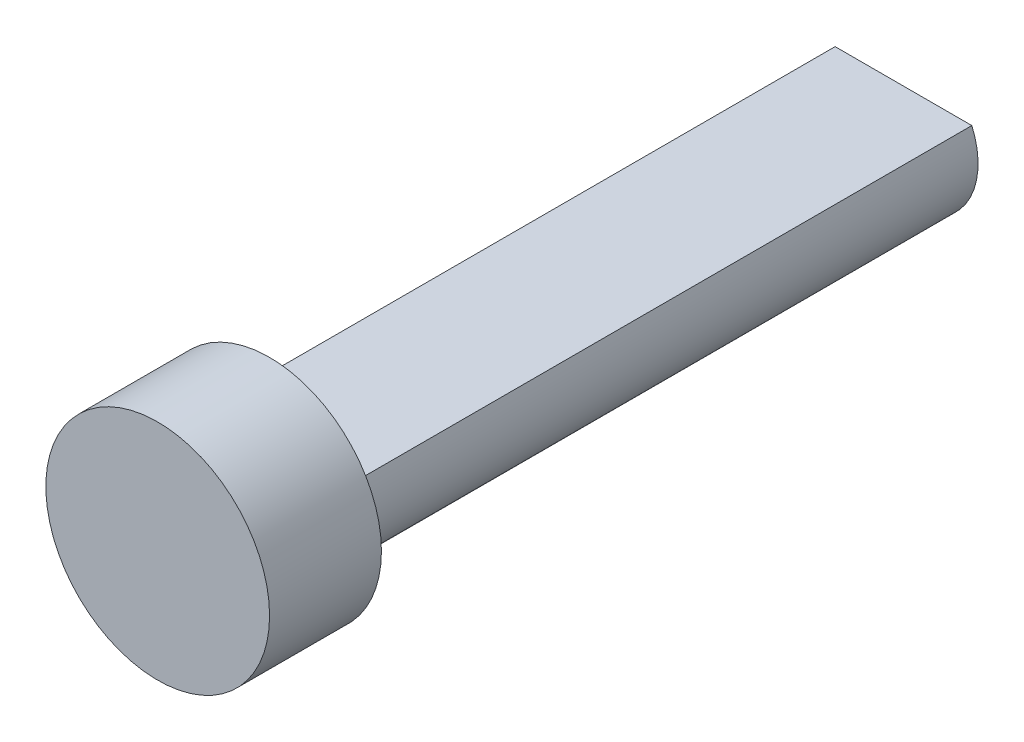
ISO-10303-21;
HEADER;
FILE_DESCRIPTION(('STEP AP214'),'2;1');
FILE_NAME('part.step','',(''),(''),'','','');
FILE_SCHEMA(('AUTOMOTIVE_DESIGN { 1 0 10303 214 1 1 1 1 }'));
ENDSEC;
DATA;
#1=APPLICATION_CONTEXT('core data for automotive mechanical design processes');
#2=APPLICATION_PROTOCOL_DEFINITION('international standard','automotive_design',2000,#1);
#3=PRODUCT_CONTEXT('',#1,'mechanical');
#4=PRODUCT('Part','Part','',(#3));
#5=PRODUCT_RELATED_PRODUCT_CATEGORY('part','',(#4));
#6=PRODUCT_DEFINITION_FORMATION('','',#4);
#7=PRODUCT_DEFINITION_CONTEXT('part definition',#1,'design');
#8=PRODUCT_DEFINITION('design','',#6,#7);
#9=PRODUCT_DEFINITION_SHAPE('','',#8);
#10=(LENGTH_UNIT() NAMED_UNIT(*) SI_UNIT(.MILLI.,.METRE.));
#11=(NAMED_UNIT(*) PLANE_ANGLE_UNIT() SI_UNIT($,.RADIAN.));
#12=(NAMED_UNIT(*) SI_UNIT($,.STERADIAN.) SOLID_ANGLE_UNIT());
#13=UNCERTAINTY_MEASURE_WITH_UNIT(LENGTH_MEASURE(1.E-05),#10,'distance_accuracy_value','');
#14=(GEOMETRIC_REPRESENTATION_CONTEXT(3) GLOBAL_UNCERTAINTY_ASSIGNED_CONTEXT((#13)) GLOBAL_UNIT_ASSIGNED_CONTEXT((#10,
#11,#12)) REPRESENTATION_CONTEXT('',''));
#15=CARTESIAN_POINT('',(0.,0.,0.));
#16=DIRECTION('',(0.,0.,1.));
#17=DIRECTION('',(1.,0.,0.));
#18=AXIS2_PLACEMENT_3D('',#15,#16,#17);
#19=CARTESIAN_POINT('',(0.,0.,20.));
#20=DIRECTION('',(0.,0.,-1.));
#21=DIRECTION('',(-1.,0.,0.));
#22=AXIS2_PLACEMENT_3D('',#19,#20,#21);
#23=CYLINDRICAL_SURFACE('',#22,2.);
#24=CARTESIAN_POINT('',(0.,0.,17.));
#25=DIRECTION('',(0.,0.,1.));
#26=DIRECTION('',(1.,0.,0.));
#27=AXIS2_PLACEMENT_3D('',#24,#25,#26);
#28=CIRCLE('',#27,2.);
#29=CARTESIAN_POINT('',(-1.83303027798234,0.8,17.));
#30=VERTEX_POINT('',#29);
#31=CARTESIAN_POINT('',(1.83303027798234,0.8,17.));
#32=VERTEX_POINT('',#31);
#33=EDGE_CURVE('E63',#30,#32,#28,.T.);
#34=ORIENTED_EDGE('',*,*,#33,.F.);
#35=DIRECTION('',(0.,0.,-1.));
#36=VECTOR('',#35,1.);
#37=CARTESIAN_POINT('',(-1.83303027798234,0.8,20.));
#38=LINE('',#37,#36);
#39=CARTESIAN_POINT('',(-1.83303027798234,0.8,0.));
#40=VERTEX_POINT('',#39);
#41=EDGE_CURVE('E52',#30,#40,#38,.T.);
#42=ORIENTED_EDGE('',*,*,#41,.T.);
#43=CARTESIAN_POINT('',(0.,0.,0.));
#44=DIRECTION('',(0.,0.,1.));
#45=DIRECTION('',(1.,0.,0.));
#46=AXIS2_PLACEMENT_3D('',#43,#44,#45);
#47=CIRCLE('',#46,2.);
#48=CARTESIAN_POINT('',(1.83303027798234,0.8,0.));
#49=VERTEX_POINT('',#48);
#50=EDGE_CURVE('E65',#40,#49,#47,.T.);
#51=ORIENTED_EDGE('',*,*,#50,.T.);
#52=DIRECTION('',(0.,0.,-1.));
#53=VECTOR('',#52,1.);
#54=CARTESIAN_POINT('',(1.83303027798234,0.8,20.));
#55=LINE('',#54,#53);
#56=EDGE_CURVE('E40',#32,#49,#55,.T.);
#57=ORIENTED_EDGE('',*,*,#56,.F.);
#58=EDGE_LOOP('',(#34,#42,#51,#57));
#59=FACE_BOUND('',#58,.T.);
#60=ADVANCED_FACE('F33',(#59),#23,.T.);
#61=CARTESIAN_POINT('',(-1.83303027798234,0.8,20.));
#62=DIRECTION('',(0.,-1.,0.));
#63=DIRECTION('',(0.,0.,-1.));
#64=AXIS2_PLACEMENT_3D('',#61,#62,#63);
#65=PLANE('',#64);
#66=DIRECTION('',(-1.,0.,0.));
#67=VECTOR('',#66,1.);
#68=CARTESIAN_POINT('',(-1.83303027798234,0.8,17.));
#69=LINE('',#68,#67);
#70=EDGE_CURVE('E11',#32,#30,#69,.T.);
#71=ORIENTED_EDGE('',*,*,#70,.F.);
#72=ORIENTED_EDGE('',*,*,#56,.T.);
#73=DIRECTION('',(-1.,0.,0.));
#74=VECTOR('',#73,1.);
#75=CARTESIAN_POINT('',(-1.83303027798234,0.8,0.));
#76=LINE('',#75,#74);
#77=EDGE_CURVE('E59',#49,#40,#76,.T.);
#78=ORIENTED_EDGE('',*,*,#77,.T.);
#79=ORIENTED_EDGE('',*,*,#41,.F.);
#80=EDGE_LOOP('',(#71,#72,#78,#79));
#81=FACE_BOUND('',#80,.T.);
#82=ADVANCED_FACE('F57',(#81),#65,.F.);
#83=CARTESIAN_POINT('',(0.,0.,0.));
#84=DIRECTION('',(0.,0.,1.));
#85=DIRECTION('',(1.,0.,0.));
#86=AXIS2_PLACEMENT_3D('',#83,#84,#85);
#87=PLANE('',#86);
#88=ORIENTED_EDGE('',*,*,#50,.F.);
#89=ORIENTED_EDGE('',*,*,#77,.F.);
#90=EDGE_LOOP('',(#88,#89));
#91=FACE_BOUND('',#90,.T.);
#92=ADVANCED_FACE('F71',(#91),#87,.F.);
#93=CARTESIAN_POINT('',(0.,0.,17.));
#94=DIRECTION('',(0.,0.,1.));
#95=DIRECTION('',(1.,0.,0.));
#96=AXIS2_PLACEMENT_3D('',#93,#94,#95);
#97=PLANE('',#96);
#98=CARTESIAN_POINT('',(0.,0.,17.));
#99=DIRECTION('',(0.,0.,1.));
#100=DIRECTION('',(1.,0.,0.));
#101=AXIS2_PLACEMENT_3D('',#98,#99,#100);
#102=CIRCLE('',#101,3.);
#103=CARTESIAN_POINT('',(3.,0.,17.));
#104=VERTEX_POINT('',#103);
#105=EDGE_CURVE('E66',#104,#104,#102,.T.);
#106=ORIENTED_EDGE('',*,*,#105,.F.);
#107=EDGE_LOOP('',(#106));
#108=FACE_BOUND('',#107,.T.);
#109=ORIENTED_EDGE('',*,*,#70,.T.);
#110=ORIENTED_EDGE('',*,*,#33,.T.);
#111=EDGE_LOOP('',(#109,#110));
#112=FACE_BOUND('',#111,.T.);
#113=ADVANCED_FACE('F68',(#108,#112),#97,.F.);
#114=CARTESIAN_POINT('',(0.,0.,17.));
#115=DIRECTION('',(0.,0.,1.));
#116=DIRECTION('',(1.,0.,0.));
#117=AXIS2_PLACEMENT_3D('',#114,#115,#116);
#118=CYLINDRICAL_SURFACE('',#117,3.);
#119=ORIENTED_EDGE('',*,*,#105,.T.);
#120=EDGE_LOOP('',(#119));
#121=FACE_BOUND('',#120,.T.);
#122=CARTESIAN_POINT('',(0.,0.,20.));
#123=DIRECTION('',(0.,0.,1.));
#124=DIRECTION('',(1.,0.,0.));
#125=AXIS2_PLACEMENT_3D('',#122,#123,#124);
#126=CIRCLE('',#125,3.);
#127=CARTESIAN_POINT('',(3.,0.,20.));
#128=VERTEX_POINT('',#127);
#129=EDGE_CURVE('E97',#128,#128,#126,.T.);
#130=ORIENTED_EDGE('',*,*,#129,.F.);
#131=EDGE_LOOP('',(#130));
#132=FACE_BOUND('',#131,.T.);
#133=ADVANCED_FACE('F70',(#121,#132),#118,.T.);
#134=CARTESIAN_POINT('',(0.,0.,20.));
#135=DIRECTION('',(0.,0.,1.));
#136=DIRECTION('',(1.,0.,0.));
#137=AXIS2_PLACEMENT_3D('',#134,#135,#136);
#138=PLANE('',#137);
#139=ORIENTED_EDGE('',*,*,#129,.T.);
#140=EDGE_LOOP('',(#139));
#141=FACE_BOUND('',#140,.T.);
#142=ADVANCED_FACE('F78',(#141),#138,.T.);
#143=CLOSED_SHELL('',(#60,#82,#92,#113,#133,#142));
#144=MANIFOLD_SOLID_BREP('B2',#143);
#145=ADVANCED_BREP_SHAPE_REPRESENTATION('',(#18,#144),#14);
#146=SHAPE_DEFINITION_REPRESENTATION(#9,#145);
ENDSEC;
END-ISO-10303-21;
